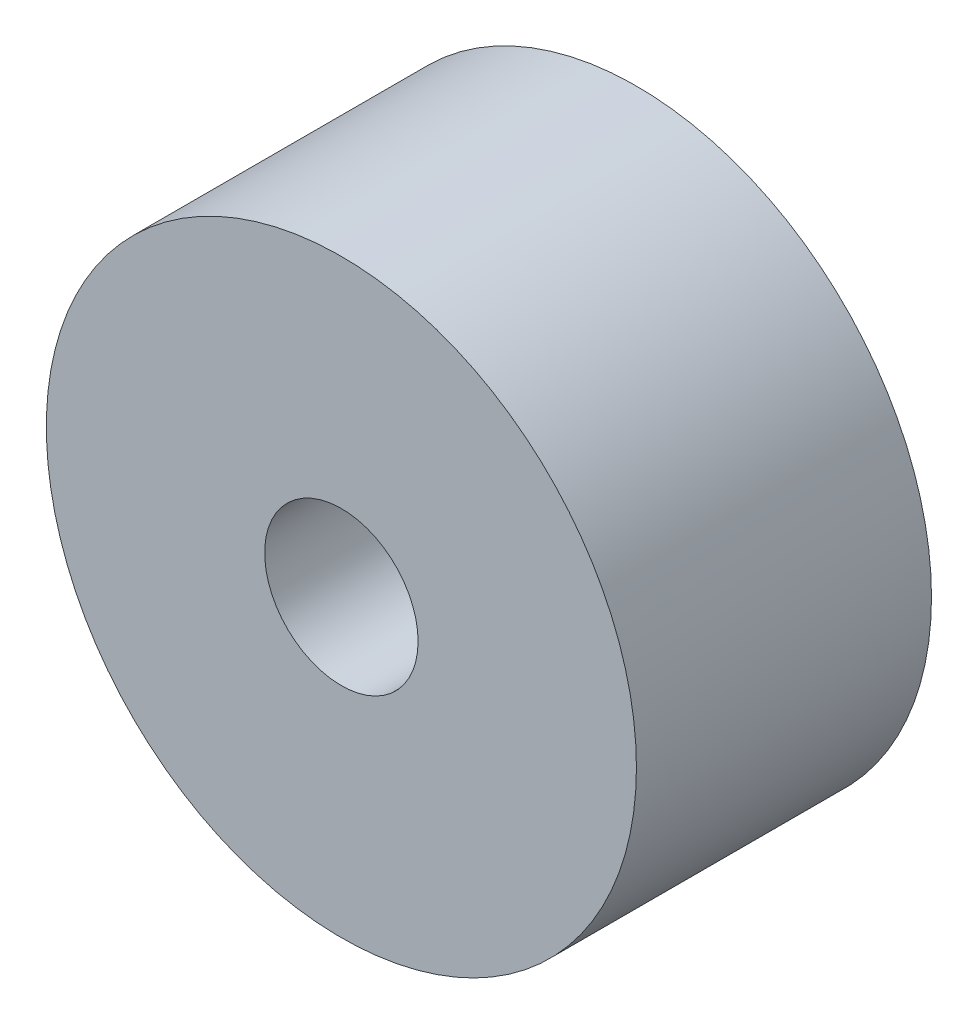
ISO-10303-21;
HEADER;
FILE_DESCRIPTION(('STEP AP214'),'2;1');
FILE_NAME('part.step','',(''),(''),'','','');
FILE_SCHEMA(('AUTOMOTIVE_DESIGN { 1 0 10303 214 1 1 1 1 }'));
ENDSEC;
DATA;
#1=APPLICATION_CONTEXT('core data for automotive mechanical design processes');
#2=APPLICATION_PROTOCOL_DEFINITION('international standard','automotive_design',2000,#1);
#3=PRODUCT_CONTEXT('',#1,'mechanical');
#4=PRODUCT('Part','Part','',(#3));
#5=PRODUCT_RELATED_PRODUCT_CATEGORY('part','',(#4));
#6=PRODUCT_DEFINITION_FORMATION('','',#4);
#7=PRODUCT_DEFINITION_CONTEXT('part definition',#1,'design');
#8=PRODUCT_DEFINITION('design','',#6,#7);
#9=PRODUCT_DEFINITION_SHAPE('','',#8);
#10=(LENGTH_UNIT() NAMED_UNIT(*) SI_UNIT(.MILLI.,.METRE.));
#11=(NAMED_UNIT(*) PLANE_ANGLE_UNIT() SI_UNIT($,.RADIAN.));
#12=(NAMED_UNIT(*) SI_UNIT($,.STERADIAN.) SOLID_ANGLE_UNIT());
#13=UNCERTAINTY_MEASURE_WITH_UNIT(LENGTH_MEASURE(1.E-05),#10,'distance_accuracy_value','');
#14=(GEOMETRIC_REPRESENTATION_CONTEXT(3) GLOBAL_UNCERTAINTY_ASSIGNED_CONTEXT((#13)) GLOBAL_UNIT_ASSIGNED_CONTEXT((#10,
#11,#12)) REPRESENTATION_CONTEXT('',''));
#15=CARTESIAN_POINT('',(0.,0.,0.));
#16=DIRECTION('',(0.,0.,1.));
#17=DIRECTION('',(1.,0.,0.));
#18=AXIS2_PLACEMENT_3D('',#15,#16,#17);
#19=CARTESIAN_POINT('',(0.,0.,5.));
#20=DIRECTION('',(0.,0.,1.));
#21=DIRECTION('',(1.,0.,0.));
#22=AXIS2_PLACEMENT_3D('',#19,#20,#21);
#23=PLANE('',#22);
#24=CARTESIAN_POINT('',(0.,0.,5.));
#25=DIRECTION('',(0.,0.,1.));
#26=DIRECTION('',(1.,0.,0.));
#27=AXIS2_PLACEMENT_3D('',#24,#25,#26);
#28=CIRCLE('',#27,5.);
#29=CARTESIAN_POINT('',(5.,0.,5.));
#30=VERTEX_POINT('',#29);
#31=EDGE_CURVE('E10',#30,#30,#28,.T.);
#32=ORIENTED_EDGE('',*,*,#31,.T.);
#33=EDGE_LOOP('',(#32));
#34=FACE_BOUND('',#33,.T.);
#35=CARTESIAN_POINT('',(0.,0.,5.));
#36=DIRECTION('',(0.,0.,1.));
#37=DIRECTION('',(1.,0.,0.));
#38=AXIS2_PLACEMENT_3D('',#35,#36,#37);
#39=CIRCLE('',#38,1.3);
#40=CARTESIAN_POINT('',(1.3,0.,5.));
#41=VERTEX_POINT('',#40);
#42=EDGE_CURVE('E50',#41,#41,#39,.T.);
#43=ORIENTED_EDGE('',*,*,#42,.F.);
#44=EDGE_LOOP('',(#43));
#45=FACE_BOUND('',#44,.T.);
#46=ADVANCED_FACE('F37',(#34,#45),#23,.T.);
#47=CARTESIAN_POINT('',(0.,0.,0.));
#48=DIRECTION('',(0.,0.,1.));
#49=DIRECTION('',(1.,0.,0.));
#50=AXIS2_PLACEMENT_3D('',#47,#48,#49);
#51=PLANE('',#50);
#52=CARTESIAN_POINT('',(0.,0.,0.));
#53=DIRECTION('',(0.,0.,1.));
#54=DIRECTION('',(1.,0.,0.));
#55=AXIS2_PLACEMENT_3D('',#52,#53,#54);
#56=CIRCLE('',#55,5.);
#57=CARTESIAN_POINT('',(5.,0.,0.));
#58=VERTEX_POINT('',#57);
#59=EDGE_CURVE('E41',#58,#58,#56,.T.);
#60=ORIENTED_EDGE('',*,*,#59,.F.);
#61=EDGE_LOOP('',(#60));
#62=FACE_BOUND('',#61,.T.);
#63=CARTESIAN_POINT('',(0.,0.,0.));
#64=DIRECTION('',(0.,0.,1.));
#65=DIRECTION('',(1.,0.,0.));
#66=AXIS2_PLACEMENT_3D('',#63,#64,#65);
#67=CIRCLE('',#66,1.3);
#68=CARTESIAN_POINT('',(1.3,0.,0.));
#69=VERTEX_POINT('',#68);
#70=EDGE_CURVE('E52',#69,#69,#67,.T.);
#71=ORIENTED_EDGE('',*,*,#70,.T.);
#72=EDGE_LOOP('',(#71));
#73=FACE_BOUND('',#72,.T.);
#74=ADVANCED_FACE('F64',(#62,#73),#51,.F.);
#75=CARTESIAN_POINT('',(0.,0.,5.));
#76=DIRECTION('',(0.,0.,-1.));
#77=DIRECTION('',(-1.,0.,0.));
#78=AXIS2_PLACEMENT_3D('',#75,#76,#77);
#79=CYLINDRICAL_SURFACE('',#78,5.);
#80=ORIENTED_EDGE('',*,*,#31,.F.);
#81=EDGE_LOOP('',(#80));
#82=FACE_BOUND('',#81,.T.);
#83=ORIENTED_EDGE('',*,*,#59,.T.);
#84=EDGE_LOOP('',(#83));
#85=FACE_BOUND('',#84,.T.);
#86=ADVANCED_FACE('F39',(#82,#85),#79,.T.);
#87=CARTESIAN_POINT('',(0.,0.,5.));
#88=DIRECTION('',(0.,0.,-1.));
#89=DIRECTION('',(-1.,0.,0.));
#90=AXIS2_PLACEMENT_3D('',#87,#88,#89);
#91=CYLINDRICAL_SURFACE('',#90,1.3);
#92=ORIENTED_EDGE('',*,*,#42,.T.);
#93=EDGE_LOOP('',(#92));
#94=FACE_BOUND('',#93,.T.);
#95=ORIENTED_EDGE('',*,*,#70,.F.);
#96=EDGE_LOOP('',(#95));
#97=FACE_BOUND('',#96,.T.);
#98=ADVANCED_FACE('F60',(#94,#97),#91,.F.);
#99=CLOSED_SHELL('',(#46,#74,#86,#98));
#100=MANIFOLD_SOLID_BREP('B2',#99);
#101=ADVANCED_BREP_SHAPE_REPRESENTATION('',(#18,#100),#14);
#102=SHAPE_DEFINITION_REPRESENTATION(#9,#101);
ENDSEC;
END-ISO-10303-21;
